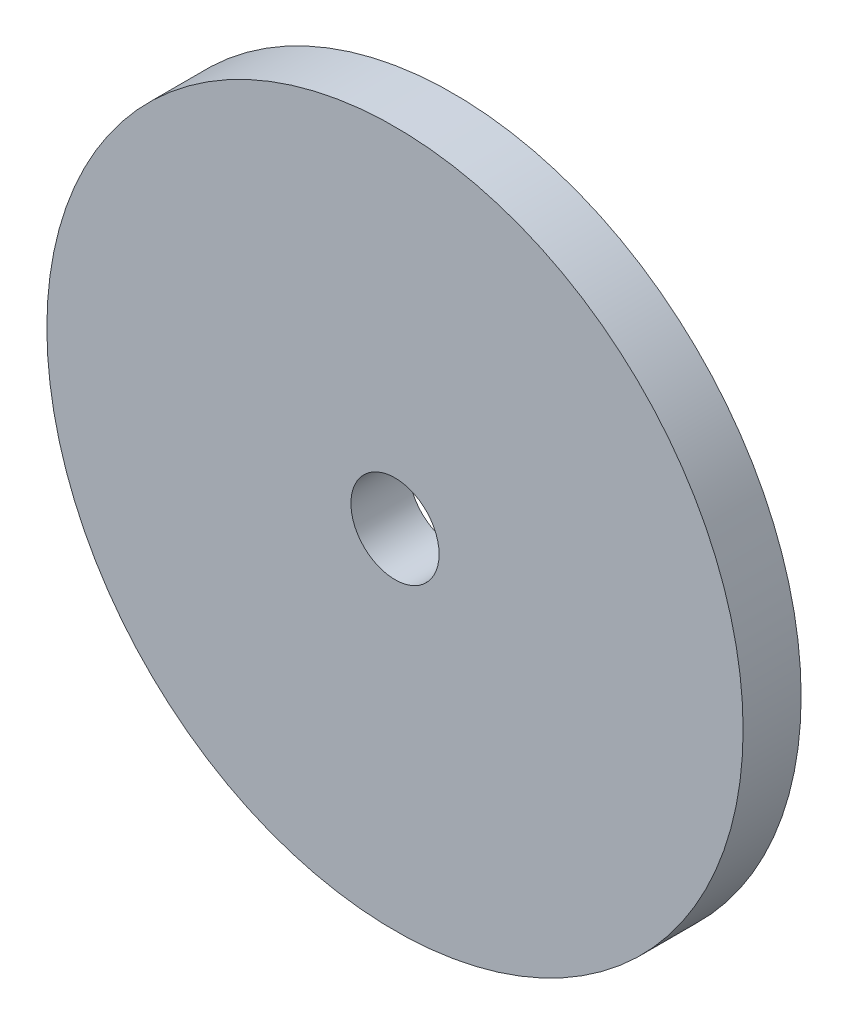
ISO-10303-21;
HEADER;
FILE_DESCRIPTION(('STEP AP214'),'2;1');
FILE_NAME('part.step','',(''),(''),'','','');
FILE_SCHEMA(('AUTOMOTIVE_DESIGN { 1 0 10303 214 1 1 1 1 }'));
ENDSEC;
DATA;
#1=APPLICATION_CONTEXT('core data for automotive mechanical design processes');
#2=APPLICATION_PROTOCOL_DEFINITION('international standard','automotive_design',2000,#1);
#3=PRODUCT_CONTEXT('',#1,'mechanical');
#4=PRODUCT('Part','Part','',(#3));
#5=PRODUCT_RELATED_PRODUCT_CATEGORY('part','',(#4));
#6=PRODUCT_DEFINITION_FORMATION('','',#4);
#7=PRODUCT_DEFINITION_CONTEXT('part definition',#1,'design');
#8=PRODUCT_DEFINITION('design','',#6,#7);
#9=PRODUCT_DEFINITION_SHAPE('','',#8);
#10=(LENGTH_UNIT() NAMED_UNIT(*) SI_UNIT(.MILLI.,.METRE.));
#11=(NAMED_UNIT(*) PLANE_ANGLE_UNIT() SI_UNIT($,.RADIAN.));
#12=(NAMED_UNIT(*) SI_UNIT($,.STERADIAN.) SOLID_ANGLE_UNIT());
#13=UNCERTAINTY_MEASURE_WITH_UNIT(LENGTH_MEASURE(1.E-05),#10,'distance_accuracy_value','');
#14=(GEOMETRIC_REPRESENTATION_CONTEXT(3) GLOBAL_UNCERTAINTY_ASSIGNED_CONTEXT((#13)) GLOBAL_UNIT_ASSIGNED_CONTEXT((#10,
#11,#12)) REPRESENTATION_CONTEXT('',''));
#15=CARTESIAN_POINT('',(0.,0.,0.));
#16=DIRECTION('',(0.,0.,1.));
#17=DIRECTION('',(1.,0.,0.));
#18=AXIS2_PLACEMENT_3D('',#15,#16,#17);
#19=CARTESIAN_POINT('',(0.,0.,6.35));
#20=DIRECTION('',(0.,0.,-1.));
#21=DIRECTION('',(-1.,0.,0.));
#22=AXIS2_PLACEMENT_3D('',#19,#20,#21);
#23=CYLINDRICAL_SURFACE('',#22,76.2);
#24=CARTESIAN_POINT('',(0.,0.,6.35));
#25=DIRECTION('',(0.,0.,1.));
#26=DIRECTION('',(1.,0.,0.));
#27=AXIS2_PLACEMENT_3D('',#24,#25,#26);
#28=CIRCLE('',#27,76.2);
#29=CARTESIAN_POINT('',(76.2,0.,6.35));
#30=VERTEX_POINT('',#29);
#31=EDGE_CURVE('E10',#30,#30,#28,.T.);
#32=ORIENTED_EDGE('',*,*,#31,.F.);
#33=EDGE_LOOP('',(#32));
#34=FACE_BOUND('',#33,.T.);
#35=CARTESIAN_POINT('',(0.,0.,-6.35));
#36=DIRECTION('',(0.,0.,1.));
#37=DIRECTION('',(1.,0.,0.));
#38=AXIS2_PLACEMENT_3D('',#35,#36,#37);
#39=CIRCLE('',#38,76.2);
#40=CARTESIAN_POINT('',(76.2,0.,-6.35));
#41=VERTEX_POINT('',#40);
#42=EDGE_CURVE('E36',#41,#41,#39,.T.);
#43=ORIENTED_EDGE('',*,*,#42,.T.);
#44=EDGE_LOOP('',(#43));
#45=FACE_BOUND('',#44,.T.);
#46=ADVANCED_FACE('F33',(#34,#45),#23,.T.);
#47=CARTESIAN_POINT('',(0.,0.,6.35));
#48=DIRECTION('',(0.,0.,1.));
#49=DIRECTION('',(1.,0.,0.));
#50=AXIS2_PLACEMENT_3D('',#47,#48,#49);
#51=PLANE('',#50);
#52=CARTESIAN_POINT('',(0.,0.,6.35));
#53=DIRECTION('',(0.,0.,1.));
#54=DIRECTION('',(1.,0.,0.));
#55=AXIS2_PLACEMENT_3D('',#52,#53,#54);
#56=CIRCLE('',#55,9.652);
#57=CARTESIAN_POINT('',(9.652,0.,6.35));
#58=VERTEX_POINT('',#57);
#59=EDGE_CURVE('E47',#58,#58,#56,.T.);
#60=ORIENTED_EDGE('',*,*,#59,.F.);
#61=EDGE_LOOP('',(#60));
#62=FACE_BOUND('',#61,.T.);
#63=ORIENTED_EDGE('',*,*,#31,.T.);
#64=EDGE_LOOP('',(#63));
#65=FACE_BOUND('',#64,.T.);
#66=ADVANCED_FACE('F53',(#62,#65),#51,.T.);
#67=CARTESIAN_POINT('',(0.,0.,-6.35));
#68=DIRECTION('',(0.,0.,1.));
#69=DIRECTION('',(1.,0.,0.));
#70=AXIS2_PLACEMENT_3D('',#67,#68,#69);
#71=PLANE('',#70);
#72=CARTESIAN_POINT('',(0.,0.,-6.35));
#73=DIRECTION('',(0.,0.,1.));
#74=DIRECTION('',(1.,0.,0.));
#75=AXIS2_PLACEMENT_3D('',#72,#73,#74);
#76=CIRCLE('',#75,9.652);
#77=CARTESIAN_POINT('',(9.652,0.,-6.35));
#78=VERTEX_POINT('',#77);
#79=EDGE_CURVE('E43',#78,#78,#76,.T.);
#80=ORIENTED_EDGE('',*,*,#79,.T.);
#81=EDGE_LOOP('',(#80));
#82=FACE_BOUND('',#81,.T.);
#83=ORIENTED_EDGE('',*,*,#42,.F.);
#84=EDGE_LOOP('',(#83));
#85=FACE_BOUND('',#84,.T.);
#86=ADVANCED_FACE('F55',(#82,#85),#71,.F.);
#87=CARTESIAN_POINT('',(0.,0.,6.35));
#88=DIRECTION('',(0.,0.,1.));
#89=DIRECTION('',(1.,0.,0.));
#90=AXIS2_PLACEMENT_3D('',#87,#88,#89);
#91=CYLINDRICAL_SURFACE('',#90,9.652);
#92=ORIENTED_EDGE('',*,*,#79,.F.);
#93=EDGE_LOOP('',(#92));
#94=FACE_BOUND('',#93,.T.);
#95=ORIENTED_EDGE('',*,*,#59,.T.);
#96=EDGE_LOOP('',(#95));
#97=FACE_BOUND('',#96,.T.);
#98=ADVANCED_FACE('F51',(#94,#97),#91,.F.);
#99=CLOSED_SHELL('',(#46,#66,#86,#98));
#100=MANIFOLD_SOLID_BREP('B2',#99);
#101=ADVANCED_BREP_SHAPE_REPRESENTATION('',(#18,#100),#14);
#102=SHAPE_DEFINITION_REPRESENTATION(#9,#101);
ENDSEC;
END-ISO-10303-21;
